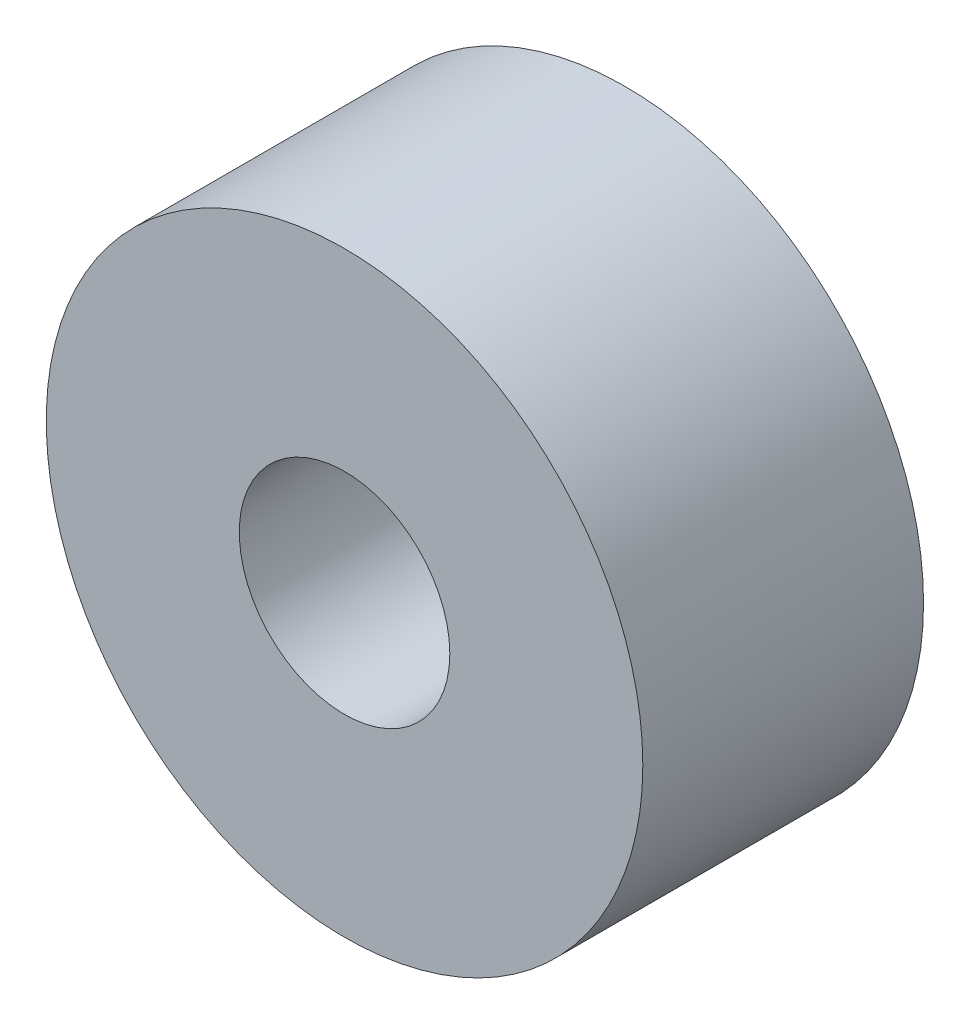
ISO-10303-21;
HEADER;
FILE_DESCRIPTION(('STEP AP214'),'2;1');
FILE_NAME('part.step','',(''),(''),'','','');
FILE_SCHEMA(('AUTOMOTIVE_DESIGN { 1 0 10303 214 1 1 1 1 }'));
ENDSEC;
DATA;
#1=APPLICATION_CONTEXT('core data for automotive mechanical design processes');
#2=APPLICATION_PROTOCOL_DEFINITION('international standard','automotive_design',2000,#1);
#3=PRODUCT_CONTEXT('',#1,'mechanical');
#4=PRODUCT('Part','Part','',(#3));
#5=PRODUCT_RELATED_PRODUCT_CATEGORY('part','',(#4));
#6=PRODUCT_DEFINITION_FORMATION('','',#4);
#7=PRODUCT_DEFINITION_CONTEXT('part definition',#1,'design');
#8=PRODUCT_DEFINITION('design','',#6,#7);
#9=PRODUCT_DEFINITION_SHAPE('','',#8);
#10=(LENGTH_UNIT() NAMED_UNIT(*) SI_UNIT(.MILLI.,.METRE.));
#11=(NAMED_UNIT(*) PLANE_ANGLE_UNIT() SI_UNIT($,.RADIAN.));
#12=(NAMED_UNIT(*) SI_UNIT($,.STERADIAN.) SOLID_ANGLE_UNIT());
#13=UNCERTAINTY_MEASURE_WITH_UNIT(LENGTH_MEASURE(1.E-05),#10,'distance_accuracy_value','');
#14=(GEOMETRIC_REPRESENTATION_CONTEXT(3) GLOBAL_UNCERTAINTY_ASSIGNED_CONTEXT((#13)) GLOBAL_UNIT_ASSIGNED_CONTEXT((#10,
#11,#12)) REPRESENTATION_CONTEXT('',''));
#15=CARTESIAN_POINT('',(0.,0.,0.));
#16=DIRECTION('',(0.,0.,1.));
#17=DIRECTION('',(1.,0.,0.));
#18=AXIS2_PLACEMENT_3D('',#15,#16,#17);
#19=CARTESIAN_POINT('',(0.,0.,-34.));
#20=DIRECTION('',(0.,0.,1.));
#21=DIRECTION('',(1.,0.,0.));
#22=AXIS2_PLACEMENT_3D('',#19,#20,#21);
#23=CYLINDRICAL_SURFACE('',#22,6.);
#24=CARTESIAN_POINT('',(0.,0.,-55.));
#25=DIRECTION('',(0.,0.,1.));
#26=DIRECTION('',(1.,0.,0.));
#27=AXIS2_PLACEMENT_3D('',#24,#25,#26);
#28=CIRCLE('',#27,6.);
#29=CARTESIAN_POINT('',(6.,0.,-55.));
#30=VERTEX_POINT('',#29);
#31=EDGE_CURVE('E53',#30,#30,#28,.T.);
#32=ORIENTED_EDGE('',*,*,#31,.F.);
#33=EDGE_LOOP('',(#32));
#34=FACE_BOUND('',#33,.T.);
#35=CARTESIAN_POINT('',(0.,0.,-39.));
#36=DIRECTION('',(0.,0.,1.));
#37=DIRECTION('',(1.,0.,0.));
#38=AXIS2_PLACEMENT_3D('',#35,#36,#37);
#39=CIRCLE('',#38,6.);
#40=CARTESIAN_POINT('',(6.,0.,-39.));
#41=VERTEX_POINT('',#40);
#42=EDGE_CURVE('E10',#41,#41,#39,.T.);
#43=ORIENTED_EDGE('',*,*,#42,.T.);
#44=EDGE_LOOP('',(#43));
#45=FACE_BOUND('',#44,.T.);
#46=ADVANCED_FACE('F39',(#34,#45),#23,.F.);
#47=CARTESIAN_POINT('',(0.,6.,-39.));
#48=DIRECTION('',(0.,0.,-1.));
#49=DIRECTION('',(-1.,0.,0.));
#50=AXIS2_PLACEMENT_3D('',#47,#48,#49);
#51=PLANE('',#50);
#52=ORIENTED_EDGE('',*,*,#42,.F.);
#53=EDGE_LOOP('',(#52));
#54=FACE_BOUND('',#53,.T.);
#55=CARTESIAN_POINT('',(0.,0.,-39.));
#56=DIRECTION('',(0.,0.,1.));
#57=DIRECTION('',(1.,0.,0.));
#58=AXIS2_PLACEMENT_3D('',#55,#56,#57);
#59=CIRCLE('',#58,17.);
#60=CARTESIAN_POINT('',(17.,0.,-39.));
#61=VERTEX_POINT('',#60);
#62=EDGE_CURVE('E45',#61,#61,#59,.T.);
#63=ORIENTED_EDGE('',*,*,#62,.T.);
#64=EDGE_LOOP('',(#63));
#65=FACE_BOUND('',#64,.T.);
#66=ADVANCED_FACE('F62',(#54,#65),#51,.F.);
#67=CARTESIAN_POINT('',(0.,0.,-34.));
#68=DIRECTION('',(0.,0.,1.));
#69=DIRECTION('',(1.,0.,0.));
#70=AXIS2_PLACEMENT_3D('',#67,#68,#69);
#71=CYLINDRICAL_SURFACE('',#70,17.);
#72=ORIENTED_EDGE('',*,*,#62,.F.);
#73=EDGE_LOOP('',(#72));
#74=FACE_BOUND('',#73,.T.);
#75=CARTESIAN_POINT('',(0.,0.,-55.));
#76=DIRECTION('',(0.,0.,1.));
#77=DIRECTION('',(1.,0.,0.));
#78=AXIS2_PLACEMENT_3D('',#75,#76,#77);
#79=CIRCLE('',#78,17.);
#80=CARTESIAN_POINT('',(17.,0.,-55.));
#81=VERTEX_POINT('',#80);
#82=EDGE_CURVE('E49',#81,#81,#79,.T.);
#83=ORIENTED_EDGE('',*,*,#82,.T.);
#84=EDGE_LOOP('',(#83));
#85=FACE_BOUND('',#84,.T.);
#86=ADVANCED_FACE('F66',(#74,#85),#71,.T.);
#87=CARTESIAN_POINT('',(0.,17.,-55.));
#88=DIRECTION('',(0.,0.,1.));
#89=DIRECTION('',(1.,0.,0.));
#90=AXIS2_PLACEMENT_3D('',#87,#88,#89);
#91=PLANE('',#90);
#92=ORIENTED_EDGE('',*,*,#82,.F.);
#93=EDGE_LOOP('',(#92));
#94=FACE_BOUND('',#93,.T.);
#95=ORIENTED_EDGE('',*,*,#31,.T.);
#96=EDGE_LOOP('',(#95));
#97=FACE_BOUND('',#96,.T.);
#98=ADVANCED_FACE('F59',(#94,#97),#91,.F.);
#99=CLOSED_SHELL('',(#46,#66,#86,#98));
#100=MANIFOLD_SOLID_BREP('B2',#99);
#101=ADVANCED_BREP_SHAPE_REPRESENTATION('',(#18,#100),#14);
#102=SHAPE_DEFINITION_REPRESENTATION(#9,#101);
ENDSEC;
END-ISO-10303-21;
